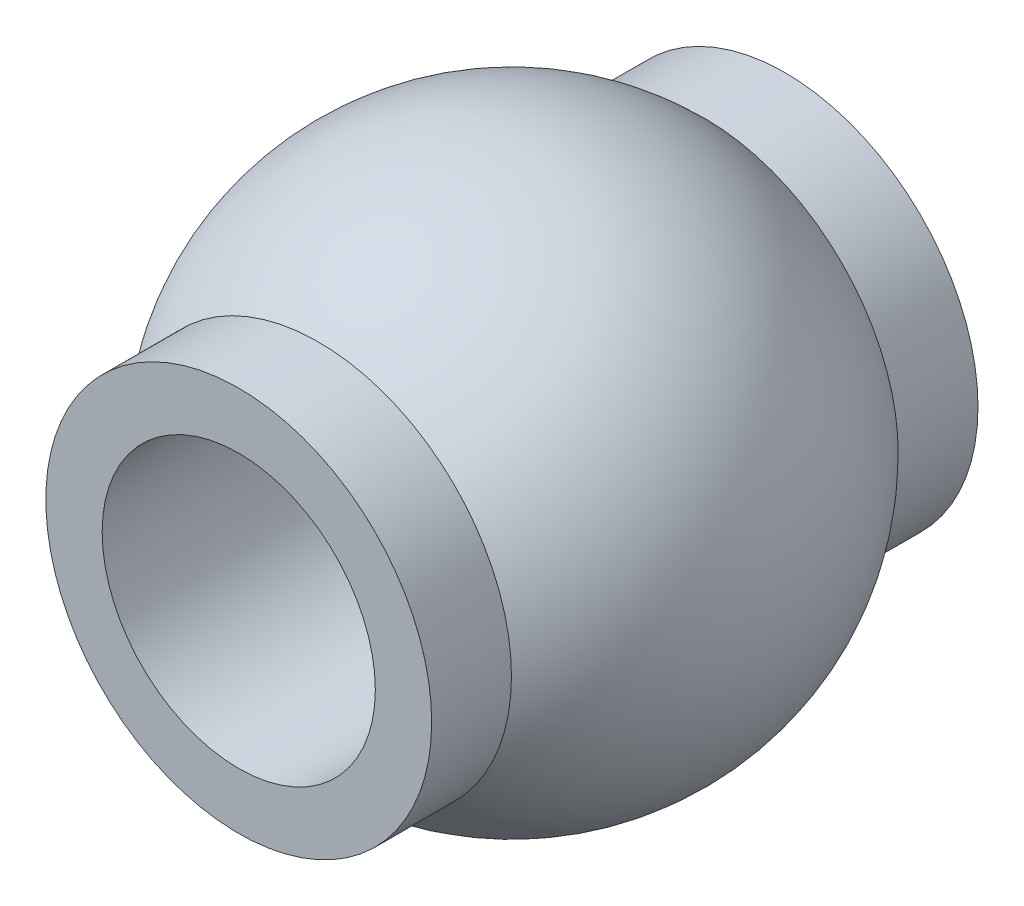
ISO-10303-21;
HEADER;
FILE_DESCRIPTION(('STEP AP214'),'2;1');
FILE_NAME('part.step','',(''),(''),'','','');
FILE_SCHEMA(('AUTOMOTIVE_DESIGN { 1 0 10303 214 1 1 1 1 }'));
ENDSEC;
DATA;
#1=APPLICATION_CONTEXT('core data for automotive mechanical design processes');
#2=APPLICATION_PROTOCOL_DEFINITION('international standard','automotive_design',2000,#1);
#3=PRODUCT_CONTEXT('',#1,'mechanical');
#4=PRODUCT('Part','Part','',(#3));
#5=PRODUCT_RELATED_PRODUCT_CATEGORY('part','',(#4));
#6=PRODUCT_DEFINITION_FORMATION('','',#4);
#7=PRODUCT_DEFINITION_CONTEXT('part definition',#1,'design');
#8=PRODUCT_DEFINITION('design','',#6,#7);
#9=PRODUCT_DEFINITION_SHAPE('','',#8);
#10=(LENGTH_UNIT() NAMED_UNIT(*) SI_UNIT(.MILLI.,.METRE.));
#11=(NAMED_UNIT(*) PLANE_ANGLE_UNIT() SI_UNIT($,.RADIAN.));
#12=(NAMED_UNIT(*) SI_UNIT($,.STERADIAN.) SOLID_ANGLE_UNIT());
#13=UNCERTAINTY_MEASURE_WITH_UNIT(LENGTH_MEASURE(1.E-05),#10,'distance_accuracy_value','');
#14=(GEOMETRIC_REPRESENTATION_CONTEXT(3) GLOBAL_UNCERTAINTY_ASSIGNED_CONTEXT((#13)) GLOBAL_UNIT_ASSIGNED_CONTEXT((#10,
#11,#12)) REPRESENTATION_CONTEXT('',''));
#15=CARTESIAN_POINT('',(0.,0.,0.));
#16=DIRECTION('',(0.,0.,1.));
#17=DIRECTION('',(1.,0.,0.));
#18=AXIS2_PLACEMENT_3D('',#15,#16,#17);
#19=CARTESIAN_POINT('',(0.,0.,0.));
#20=DIRECTION('',(0.,-1.,0.));
#21=DIRECTION('',(-1.,0.,0.));
#22=AXIS2_PLACEMENT_3D('',#19,#20,#21);
#23=SPHERICAL_SURFACE('',#22,11.1125);
#24=CARTESIAN_POINT('',(0.,0.,0.));
#25=DIRECTION('',(0.,0.,1.));
#26=DIRECTION('',(1.,0.,0.));
#27=AXIS2_PLACEMENT_3D('',#24,#25,#26);
#28=SPHERICAL_SURFACE('',#27,11.1125);
#29=CARTESIAN_POINT('',(0.,0.,7.86683762956882));
#30=DIRECTION('',(0.,0.,1.));
#31=DIRECTION('',(1.,0.,0.));
#32=AXIS2_PLACEMENT_3D('',#29,#30,#31);
#33=CIRCLE('',#32,7.8486);
#34=CARTESIAN_POINT('',(7.8486,0.,7.86683762956882));
#35=VERTEX_POINT('',#34);
#36=EDGE_CURVE('E11',#35,#35,#33,.T.);
#37=ORIENTED_EDGE('',*,*,#36,.F.);
#38=EDGE_LOOP('',(#37));
#39=FACE_BOUND('',#38,.T.);
#40=CARTESIAN_POINT('',(0.,0.,-7.86683762956882));
#41=DIRECTION('',(0.,0.,-1.));
#42=DIRECTION('',(-1.,0.,0.));
#43=AXIS2_PLACEMENT_3D('',#40,#41,#42);
#44=CIRCLE('',#43,7.8486);
#45=CARTESIAN_POINT('',(-7.8486,0.,-7.86683762956882));
#46=VERTEX_POINT('',#45);
#47=EDGE_CURVE('E46',#46,#46,#44,.T.);
#48=ORIENTED_EDGE('',*,*,#47,.F.);
#49=EDGE_LOOP('',(#48));
#50=FACE_BOUND('',#49,.T.);
#51=ADVANCED_FACE('F31',(#39,#50),#28,.T.);
#52=CARTESIAN_POINT('',(0.,0.,-25.4));
#53=DIRECTION('',(0.,0.,1.));
#54=DIRECTION('',(1.,0.,0.));
#55=AXIS2_PLACEMENT_3D('',#52,#53,#54);
#56=CYLINDRICAL_SURFACE('',#55,5.55625);
#57=CARTESIAN_POINT('',(0.,0.,11.1125));
#58=DIRECTION('',(0.,0.,1.));
#59=DIRECTION('',(1.,0.,0.));
#60=AXIS2_PLACEMENT_3D('',#57,#58,#59);
#61=CIRCLE('',#60,5.55625);
#62=CARTESIAN_POINT('',(5.55625,0.,11.1125));
#63=VERTEX_POINT('',#62);
#64=EDGE_CURVE('E41',#63,#63,#61,.T.);
#65=ORIENTED_EDGE('',*,*,#64,.T.);
#66=EDGE_LOOP('',(#65));
#67=FACE_BOUND('',#66,.T.);
#68=CARTESIAN_POINT('',(0.,0.,-11.1125));
#69=DIRECTION('',(0.,0.,1.));
#70=DIRECTION('',(1.,0.,0.));
#71=AXIS2_PLACEMENT_3D('',#68,#69,#70);
#72=CIRCLE('',#71,5.55625);
#73=CARTESIAN_POINT('',(5.55625,0.,-11.1125));
#74=VERTEX_POINT('',#73);
#75=EDGE_CURVE('E50',#74,#74,#72,.T.);
#76=ORIENTED_EDGE('',*,*,#75,.F.);
#77=EDGE_LOOP('',(#76));
#78=FACE_BOUND('',#77,.T.);
#79=ADVANCED_FACE('F71',(#67,#78),#56,.F.);
#80=CARTESIAN_POINT('',(0.,0.,44.424193131283));
#81=DIRECTION('',(0.,0.,-1.));
#82=DIRECTION('',(-1.,0.,0.));
#83=AXIS2_PLACEMENT_3D('',#80,#81,#82);
#84=CYLINDRICAL_SURFACE('',#83,7.8486);
#85=ORIENTED_EDGE('',*,*,#36,.T.);
#86=EDGE_LOOP('',(#85));
#87=FACE_BOUND('',#86,.T.);
#88=CARTESIAN_POINT('',(0.,0.,11.1125));
#89=DIRECTION('',(0.,0.,1.));
#90=DIRECTION('',(1.,0.,0.));
#91=AXIS2_PLACEMENT_3D('',#88,#89,#90);
#92=CIRCLE('',#91,7.8486);
#93=CARTESIAN_POINT('',(7.8486,0.,11.1125));
#94=VERTEX_POINT('',#93);
#95=EDGE_CURVE('E37',#94,#94,#92,.T.);
#96=ORIENTED_EDGE('',*,*,#95,.F.);
#97=EDGE_LOOP('',(#96));
#98=FACE_BOUND('',#97,.T.);
#99=ADVANCED_FACE('F76',(#87,#98),#84,.T.);
#100=CARTESIAN_POINT('',(0.,0.,11.1125));
#101=DIRECTION('',(0.,0.,1.));
#102=DIRECTION('',(1.,0.,0.));
#103=AXIS2_PLACEMENT_3D('',#100,#101,#102);
#104=PLANE('',#103);
#105=ORIENTED_EDGE('',*,*,#64,.F.);
#106=EDGE_LOOP('',(#105));
#107=FACE_BOUND('',#106,.T.);
#108=ORIENTED_EDGE('',*,*,#95,.T.);
#109=EDGE_LOOP('',(#108));
#110=FACE_BOUND('',#109,.T.);
#111=ADVANCED_FACE('F67',(#107,#110),#104,.T.);
#112=CARTESIAN_POINT('',(0.,0.,-44.424193131283));
#113=DIRECTION('',(0.,0.,1.));
#114=DIRECTION('',(1.,0.,0.));
#115=AXIS2_PLACEMENT_3D('',#112,#113,#114);
#116=CYLINDRICAL_SURFACE('',#115,7.8486);
#117=CARTESIAN_POINT('',(0.,0.,-11.1125));
#118=DIRECTION('',(0.,0.,1.));
#119=DIRECTION('',(1.,0.,0.));
#120=AXIS2_PLACEMENT_3D('',#117,#118,#119);
#121=CIRCLE('',#120,7.8486);
#122=CARTESIAN_POINT('',(7.8486,0.,-11.1125));
#123=VERTEX_POINT('',#122);
#124=EDGE_CURVE('E53',#123,#123,#121,.T.);
#125=ORIENTED_EDGE('',*,*,#124,.T.);
#126=EDGE_LOOP('',(#125));
#127=FACE_BOUND('',#126,.T.);
#128=ORIENTED_EDGE('',*,*,#47,.T.);
#129=EDGE_LOOP('',(#128));
#130=FACE_BOUND('',#129,.T.);
#131=ADVANCED_FACE('F57',(#127,#130),#116,.T.);
#132=CARTESIAN_POINT('',(0.,0.,-11.1125));
#133=DIRECTION('',(0.,0.,1.));
#134=DIRECTION('',(1.,0.,0.));
#135=AXIS2_PLACEMENT_3D('',#132,#133,#134);
#136=PLANE('',#135);
#137=ORIENTED_EDGE('',*,*,#75,.T.);
#138=EDGE_LOOP('',(#137));
#139=FACE_BOUND('',#138,.T.);
#140=ORIENTED_EDGE('',*,*,#124,.F.);
#141=EDGE_LOOP('',(#140));
#142=FACE_BOUND('',#141,.T.);
#143=ADVANCED_FACE('F60',(#139,#142),#136,.F.);
#144=CLOSED_SHELL('',(#51,#79,#99,#111,#131,#143));
#145=MANIFOLD_SOLID_BREP('B2',#144);
#146=ADVANCED_BREP_SHAPE_REPRESENTATION('',(#18,#145),#14);
#147=SHAPE_DEFINITION_REPRESENTATION(#9,#146);
ENDSEC;
END-ISO-10303-21;
